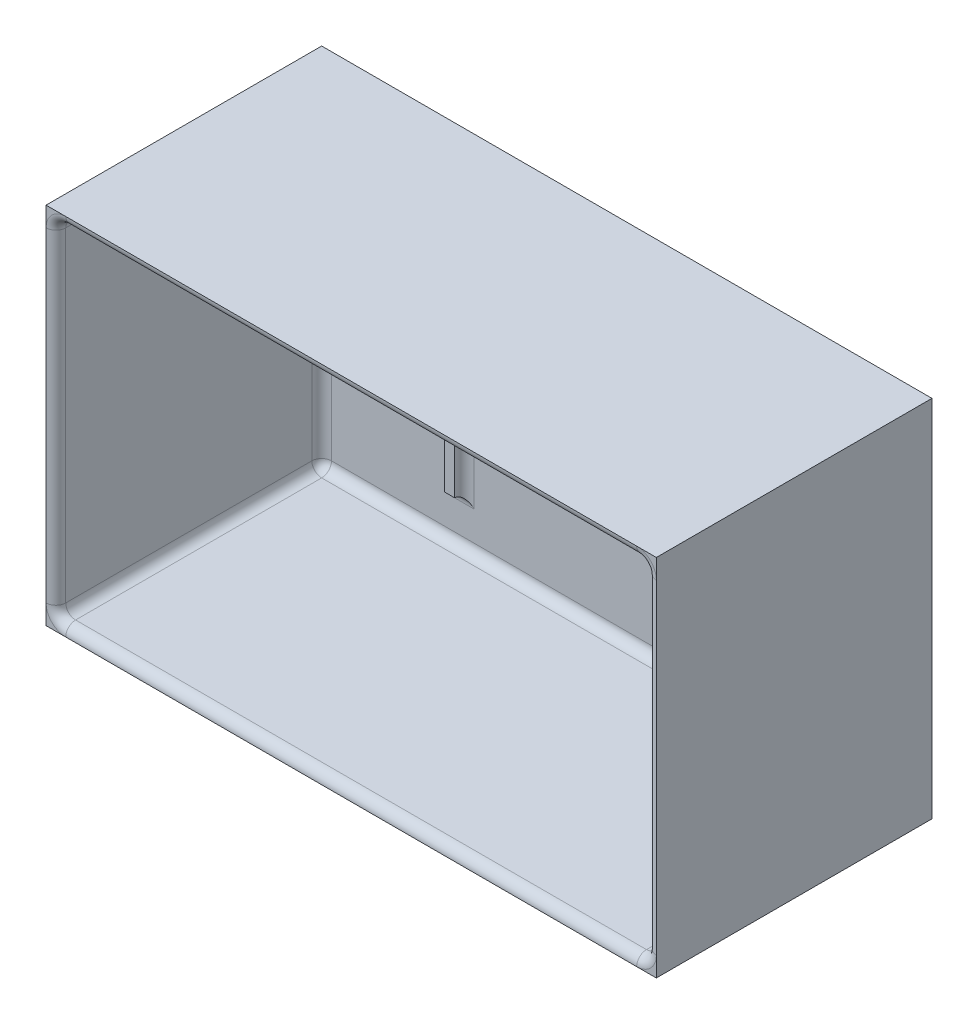
ISO-10303-21;
HEADER;
FILE_DESCRIPTION(('STEP AP214'),'2;1');
FILE_NAME('part.step','',(''),(''),'','','');
FILE_SCHEMA(('AUTOMOTIVE_DESIGN { 1 0 10303 214 1 1 1 1 }'));
ENDSEC;
DATA;
#1=APPLICATION_CONTEXT('core data for automotive mechanical design processes');
#2=APPLICATION_PROTOCOL_DEFINITION('international standard','automotive_design',2000,#1);
#3=PRODUCT_CONTEXT('',#1,'mechanical');
#4=PRODUCT('Part','Part','',(#3));
#5=PRODUCT_RELATED_PRODUCT_CATEGORY('part','',(#4));
#6=PRODUCT_DEFINITION_FORMATION('','',#4);
#7=PRODUCT_DEFINITION_CONTEXT('part definition',#1,'design');
#8=PRODUCT_DEFINITION('design','',#6,#7);
#9=PRODUCT_DEFINITION_SHAPE('','',#8);
#10=(LENGTH_UNIT() NAMED_UNIT(*) SI_UNIT(.MILLI.,.METRE.));
#11=(NAMED_UNIT(*) PLANE_ANGLE_UNIT() SI_UNIT($,.RADIAN.));
#12=(NAMED_UNIT(*) SI_UNIT($,.STERADIAN.) SOLID_ANGLE_UNIT());
#13=UNCERTAINTY_MEASURE_WITH_UNIT(LENGTH_MEASURE(1.E-05),#10,'distance_accuracy_value','');
#14=(GEOMETRIC_REPRESENTATION_CONTEXT(3) GLOBAL_UNCERTAINTY_ASSIGNED_CONTEXT((#13)) GLOBAL_UNIT_ASSIGNED_CONTEXT((#10,
#11,#12)) REPRESENTATION_CONTEXT('',''));
#15=CARTESIAN_POINT('',(0.,0.,0.));
#16=DIRECTION('',(0.,0.,1.));
#17=DIRECTION('',(1.,0.,0.));
#18=AXIS2_PLACEMENT_3D('',#15,#16,#17);
#19=CARTESIAN_POINT('',(0.,0.,1.));
#20=DIRECTION('',(0.,0.,-1.));
#21=DIRECTION('',(-1.,0.,0.));
#22=AXIS2_PLACEMENT_3D('',#19,#20,#21);
#23=PLANE('',#22);
#24=DIRECTION('',(-1.,0.,0.));
#25=VECTOR('',#24,1.);
#26=CARTESIAN_POINT('',(46.5,32.,1.));
#27=LINE('',#26,#25);
#28=CARTESIAN_POINT('',(44.5,32.,1.));
#29=VERTEX_POINT('',#28);
#30=CARTESIAN_POINT('',(47.5,32.,1.));
#31=VERTEX_POINT('',#30);
#32=EDGE_CURVE('E42',#29,#31,#27,.F.);
#33=ORIENTED_EDGE('',*,*,#32,.T.);
#34=DIRECTION('',(0.,1.,0.));
#35=VECTOR('',#34,1.);
#36=CARTESIAN_POINT('',(47.5,6.,1.));
#37=LINE('',#36,#35);
#38=CARTESIAN_POINT('',(47.5,5.,1.));
#39=VERTEX_POINT('',#38);
#40=EDGE_CURVE('E11',#31,#39,#37,.F.);
#41=ORIENTED_EDGE('',*,*,#40,.T.);
#42=DIRECTION('',(1.,0.,0.));
#43=VECTOR('',#42,1.);
#44=CARTESIAN_POINT('',(45.5,5.,1.));
#45=LINE('',#44,#43);
#46=CARTESIAN_POINT('',(44.5,5.,1.));
#47=VERTEX_POINT('',#46);
#48=EDGE_CURVE('E252',#39,#47,#45,.F.);
#49=ORIENTED_EDGE('',*,*,#48,.T.);
#50=DIRECTION('',(0.,-1.,0.));
#51=VECTOR('',#50,1.);
#52=CARTESIAN_POINT('',(44.5,31.,1.));
#53=LINE('',#52,#51);
#54=EDGE_CURVE('E229',#47,#29,#53,.F.);
#55=ORIENTED_EDGE('',*,*,#54,.T.);
#56=EDGE_LOOP('',(#33,#41,#49,#55));
#57=FACE_BOUND('',#56,.T.);
#58=DIRECTION('',(-1.,0.,0.));
#59=VECTOR('',#58,1.);
#60=CARTESIAN_POINT('',(15.5,32.,1.));
#61=LINE('',#60,#59);
#62=CARTESIAN_POINT('',(13.5,32.,1.));
#63=VERTEX_POINT('',#62);
#64=CARTESIAN_POINT('',(16.5,32.,1.));
#65=VERTEX_POINT('',#64);
#66=EDGE_CURVE('E257',#63,#65,#61,.F.);
#67=ORIENTED_EDGE('',*,*,#66,.T.);
#68=DIRECTION('',(0.,1.,0.));
#69=VECTOR('',#68,1.);
#70=CARTESIAN_POINT('',(16.5,6.,1.));
#71=LINE('',#70,#69);
#72=CARTESIAN_POINT('',(16.5,5.,1.));
#73=VERTEX_POINT('',#72);
#74=EDGE_CURVE('E255',#65,#73,#71,.F.);
#75=ORIENTED_EDGE('',*,*,#74,.T.);
#76=DIRECTION('',(1.,0.,0.));
#77=VECTOR('',#76,1.);
#78=CARTESIAN_POINT('',(14.5,5.,1.));
#79=LINE('',#78,#77);
#80=CARTESIAN_POINT('',(13.5,5.,1.));
#81=VERTEX_POINT('',#80);
#82=EDGE_CURVE('E260',#73,#81,#79,.F.);
#83=ORIENTED_EDGE('',*,*,#82,.T.);
#84=DIRECTION('',(0.,-1.,0.));
#85=VECTOR('',#84,1.);
#86=CARTESIAN_POINT('',(13.5,31.,1.));
#87=LINE('',#86,#85);
#88=EDGE_CURVE('E262',#81,#63,#87,.F.);
#89=ORIENTED_EDGE('',*,*,#88,.T.);
#90=EDGE_LOOP('',(#67,#75,#83,#89));
#91=FACE_BOUND('',#90,.T.);
#92=DIRECTION('',(0.,1.,0.));
#93=VECTOR('',#92,1.);
#94=CARTESIAN_POINT('',(60.,0.,1.));
#95=LINE('',#94,#93);
#96=CARTESIAN_POINT('',(60.,2.,1.));
#97=VERTEX_POINT('',#96);
#98=CARTESIAN_POINT('',(60.,35.,1.));
#99=VERTEX_POINT('',#98);
#100=EDGE_CURVE('E337',#97,#99,#95,.T.);
#101=ORIENTED_EDGE('',*,*,#100,.T.);
#102=DIRECTION('',(-1.,0.,0.));
#103=VECTOR('',#102,1.);
#104=CARTESIAN_POINT('',(0.,35.,1.));
#105=LINE('',#104,#103);
#106=CARTESIAN_POINT('',(2.,35.,1.));
#107=VERTEX_POINT('',#106);
#108=EDGE_CURVE('E264',#99,#107,#105,.T.);
#109=ORIENTED_EDGE('',*,*,#108,.T.);
#110=DIRECTION('',(0.,-1.,0.));
#111=VECTOR('',#110,1.);
#112=CARTESIAN_POINT('',(2.,0.,1.));
#113=LINE('',#112,#111);
#114=CARTESIAN_POINT('',(2.,2.,1.));
#115=VERTEX_POINT('',#114);
#116=EDGE_CURVE('E341',#107,#115,#113,.T.);
#117=ORIENTED_EDGE('',*,*,#116,.T.);
#118=DIRECTION('',(1.,0.,0.));
#119=VECTOR('',#118,1.);
#120=CARTESIAN_POINT('',(0.,2.,1.));
#121=LINE('',#120,#119);
#122=EDGE_CURVE('E339',#115,#97,#121,.T.);
#123=ORIENTED_EDGE('',*,*,#122,.T.);
#124=EDGE_LOOP('',(#101,#109,#117,#123));
#125=FACE_BOUND('',#124,.T.);
#126=ADVANCED_FACE('F33',(#57,#91,#125),#23,.F.);
#127=CARTESIAN_POINT('',(0.,0.,28.));
#128=DIRECTION('',(0.,0.,-1.));
#129=DIRECTION('',(-1.,0.,0.));
#130=AXIS2_PLACEMENT_3D('',#127,#128,#129);
#131=PLANE('',#130);
#132=CARTESIAN_POINT('',(2.,2.,28.));
#133=DIRECTION('',(0.,0.,-1.));
#134=DIRECTION('',(-1.,0.,0.));
#135=AXIS2_PLACEMENT_3D('',#132,#133,#134);
#136=CIRCLE('',#135,2.);
#137=CARTESIAN_POINT('',(0.,2.,28.));
#138=VERTEX_POINT('',#137);
#139=CARTESIAN_POINT('',(2.,0.,28.));
#140=VERTEX_POINT('',#139);
#141=EDGE_CURVE('E370',#138,#140,#136,.F.);
#142=ORIENTED_EDGE('',*,*,#141,.F.);
#143=DIRECTION('',(0.,-1.,0.));
#144=VECTOR('',#143,1.);
#145=CARTESIAN_POINT('',(0.,0.,28.));
#146=LINE('',#145,#144);
#147=CARTESIAN_POINT('',(0.,0.,28.));
#148=VERTEX_POINT('',#147);
#149=EDGE_CURVE('E406',#138,#148,#146,.T.);
#150=ORIENTED_EDGE('',*,*,#149,.T.);
#151=DIRECTION('',(1.,0.,0.));
#152=VECTOR('',#151,1.);
#153=CARTESIAN_POINT('',(0.,0.,28.));
#154=LINE('',#153,#152);
#155=EDGE_CURVE('E422',#148,#140,#154,.T.);
#156=ORIENTED_EDGE('',*,*,#155,.T.);
#157=EDGE_LOOP('',(#142,#150,#156));
#158=FACE_BOUND('',#157,.T.);
#159=ADVANCED_FACE('F454',(#158),#131,.F.);
#160=CARTESIAN_POINT('',(60.,35.,28.));
#161=DIRECTION('',(0.,0.,-1.));
#162=DIRECTION('',(-1.,0.,0.));
#163=AXIS2_PLACEMENT_3D('',#160,#161,#162);
#164=CIRCLE('',#163,2.);
#165=CARTESIAN_POINT('',(62.,35.,28.));
#166=VERTEX_POINT('',#165);
#167=CARTESIAN_POINT('',(60.,37.,28.));
#168=VERTEX_POINT('',#167);
#169=EDGE_CURVE('E373',#166,#168,#164,.F.);
#170=ORIENTED_EDGE('',*,*,#169,.F.);
#171=DIRECTION('',(0.,1.,0.));
#172=VECTOR('',#171,1.);
#173=CARTESIAN_POINT('',(62.,0.,28.));
#174=LINE('',#173,#172);
#175=CARTESIAN_POINT('',(62.,37.,28.));
#176=VERTEX_POINT('',#175);
#177=EDGE_CURVE('E421',#166,#176,#174,.T.);
#178=ORIENTED_EDGE('',*,*,#177,.T.);
#179=DIRECTION('',(-1.,0.,0.));
#180=VECTOR('',#179,1.);
#181=CARTESIAN_POINT('',(0.,37.,28.));
#182=LINE('',#181,#180);
#183=EDGE_CURVE('E403',#176,#168,#182,.T.);
#184=ORIENTED_EDGE('',*,*,#183,.T.);
#185=EDGE_LOOP('',(#170,#178,#184));
#186=FACE_BOUND('',#185,.T.);
#187=ADVANCED_FACE('F459',(#186),#131,.F.);
#188=CARTESIAN_POINT('',(60.,2.,28.));
#189=DIRECTION('',(0.,0.,-1.));
#190=DIRECTION('',(-1.,0.,0.));
#191=AXIS2_PLACEMENT_3D('',#188,#189,#190);
#192=CIRCLE('',#191,2.);
#193=CARTESIAN_POINT('',(60.,0.,28.));
#194=VERTEX_POINT('',#193);
#195=CARTESIAN_POINT('',(62.,2.,28.));
#196=VERTEX_POINT('',#195);
#197=EDGE_CURVE('E376',#194,#196,#192,.F.);
#198=ORIENTED_EDGE('',*,*,#197,.F.);
#199=CARTESIAN_POINT('',(62.,0.,28.));
#200=VERTEX_POINT('',#199);
#201=EDGE_CURVE('E426',#194,#200,#154,.T.);
#202=ORIENTED_EDGE('',*,*,#201,.T.);
#203=EDGE_CURVE('E417',#200,#196,#174,.T.);
#204=ORIENTED_EDGE('',*,*,#203,.T.);
#205=EDGE_LOOP('',(#198,#202,#204));
#206=FACE_BOUND('',#205,.T.);
#207=ADVANCED_FACE('F623',(#206),#131,.F.);
#208=CARTESIAN_POINT('',(2.,35.,28.));
#209=DIRECTION('',(0.,0.,-1.));
#210=DIRECTION('',(-1.,0.,0.));
#211=AXIS2_PLACEMENT_3D('',#208,#209,#210);
#212=CIRCLE('',#211,2.);
#213=CARTESIAN_POINT('',(2.,37.,28.));
#214=VERTEX_POINT('',#213);
#215=CARTESIAN_POINT('',(0.,35.,28.));
#216=VERTEX_POINT('',#215);
#217=EDGE_CURVE('E379',#214,#216,#212,.F.);
#218=ORIENTED_EDGE('',*,*,#217,.F.);
#219=CARTESIAN_POINT('',(0.,37.,28.));
#220=VERTEX_POINT('',#219);
#221=EDGE_CURVE('E416',#214,#220,#182,.T.);
#222=ORIENTED_EDGE('',*,*,#221,.T.);
#223=EDGE_CURVE('E427',#220,#216,#146,.T.);
#224=ORIENTED_EDGE('',*,*,#223,.T.);
#225=EDGE_LOOP('',(#218,#222,#224));
#226=FACE_BOUND('',#225,.T.);
#227=ADVANCED_FACE('F462',(#226),#131,.F.);
#228=CARTESIAN_POINT('',(0.,0.,28.));
#229=DIRECTION('',(1.,0.,0.));
#230=DIRECTION('',(0.,0.,-1.));
#231=AXIS2_PLACEMENT_3D('',#228,#229,#230);
#232=PLANE('',#231);
#233=DIRECTION('',(0.,-1.,0.));
#234=VECTOR('',#233,1.);
#235=CARTESIAN_POINT('',(0.,0.,0.));
#236=LINE('',#235,#234);
#237=CARTESIAN_POINT('',(0.,37.,0.));
#238=VERTEX_POINT('',#237);
#239=CARTESIAN_POINT('',(0.,0.,0.));
#240=VERTEX_POINT('',#239);
#241=EDGE_CURVE('E268',#238,#240,#236,.T.);
#242=ORIENTED_EDGE('',*,*,#241,.T.);
#243=DIRECTION('',(0.,0.,-1.));
#244=VECTOR('',#243,1.);
#245=CARTESIAN_POINT('',(0.,0.,28.));
#246=LINE('',#245,#244);
#247=EDGE_CURVE('E391',#148,#240,#246,.T.);
#248=ORIENTED_EDGE('',*,*,#247,.F.);
#249=ORIENTED_EDGE('',*,*,#149,.F.);
#250=EDGE_CURVE('E430',#216,#138,#146,.T.);
#251=ORIENTED_EDGE('',*,*,#250,.F.);
#252=ORIENTED_EDGE('',*,*,#223,.F.);
#253=DIRECTION('',(0.,0.,-1.));
#254=VECTOR('',#253,1.);
#255=CARTESIAN_POINT('',(0.,37.,28.));
#256=LINE('',#255,#254);
#257=EDGE_CURVE('E400',#220,#238,#256,.T.);
#258=ORIENTED_EDGE('',*,*,#257,.T.);
#259=EDGE_LOOP('',(#242,#248,#249,#251,#252,#258));
#260=FACE_BOUND('',#259,.T.);
#261=ADVANCED_FACE('F484',(#260),#232,.F.);
#262=CARTESIAN_POINT('',(0.,0.,28.));
#263=DIRECTION('',(0.,1.,0.));
#264=DIRECTION('',(0.,0.,1.));
#265=AXIS2_PLACEMENT_3D('',#262,#263,#264);
#266=PLANE('',#265);
#267=DIRECTION('',(1.,0.,0.));
#268=VECTOR('',#267,1.);
#269=CARTESIAN_POINT('',(0.,0.,0.));
#270=LINE('',#269,#268);
#271=CARTESIAN_POINT('',(62.,0.,0.));
#272=VERTEX_POINT('',#271);
#273=EDGE_CURVE('E409',#240,#272,#270,.T.);
#274=ORIENTED_EDGE('',*,*,#273,.T.);
#275=DIRECTION('',(0.,0.,-1.));
#276=VECTOR('',#275,1.);
#277=CARTESIAN_POINT('',(62.,0.,28.));
#278=LINE('',#277,#276);
#279=EDGE_CURVE('E394',#200,#272,#278,.T.);
#280=ORIENTED_EDGE('',*,*,#279,.F.);
#281=ORIENTED_EDGE('',*,*,#201,.F.);
#282=EDGE_CURVE('E425',#140,#194,#154,.T.);
#283=ORIENTED_EDGE('',*,*,#282,.F.);
#284=ORIENTED_EDGE('',*,*,#155,.F.);
#285=ORIENTED_EDGE('',*,*,#247,.T.);
#286=EDGE_LOOP('',(#274,#280,#281,#283,#284,#285));
#287=FACE_BOUND('',#286,.T.);
#288=ADVANCED_FACE('F480',(#287),#266,.F.);
#289=CARTESIAN_POINT('',(62.,0.,28.));
#290=DIRECTION('',(-1.,0.,0.));
#291=DIRECTION('',(0.,0.,1.));
#292=AXIS2_PLACEMENT_3D('',#289,#290,#291);
#293=PLANE('',#292);
#294=DIRECTION('',(0.,1.,0.));
#295=VECTOR('',#294,1.);
#296=CARTESIAN_POINT('',(62.,0.,0.));
#297=LINE('',#296,#295);
#298=CARTESIAN_POINT('',(62.,37.,0.));
#299=VERTEX_POINT('',#298);
#300=EDGE_CURVE('E407',#272,#299,#297,.T.);
#301=ORIENTED_EDGE('',*,*,#300,.T.);
#302=DIRECTION('',(0.,0.,-1.));
#303=VECTOR('',#302,1.);
#304=CARTESIAN_POINT('',(62.,37.,28.));
#305=LINE('',#304,#303);
#306=EDGE_CURVE('E397',#176,#299,#305,.T.);
#307=ORIENTED_EDGE('',*,*,#306,.F.);
#308=ORIENTED_EDGE('',*,*,#177,.F.);
#309=EDGE_CURVE('E420',#196,#166,#174,.T.);
#310=ORIENTED_EDGE('',*,*,#309,.F.);
#311=ORIENTED_EDGE('',*,*,#203,.F.);
#312=ORIENTED_EDGE('',*,*,#279,.T.);
#313=EDGE_LOOP('',(#301,#307,#308,#310,#311,#312));
#314=FACE_BOUND('',#313,.T.);
#315=ADVANCED_FACE('F476',(#314),#293,.F.);
#316=CARTESIAN_POINT('',(0.,37.,28.));
#317=DIRECTION('',(0.,-1.,0.));
#318=DIRECTION('',(0.,0.,-1.));
#319=AXIS2_PLACEMENT_3D('',#316,#317,#318);
#320=PLANE('',#319);
#321=DIRECTION('',(-1.,0.,0.));
#322=VECTOR('',#321,1.);
#323=CARTESIAN_POINT('',(0.,37.,0.));
#324=LINE('',#323,#322);
#325=EDGE_CURVE('E404',#299,#238,#324,.T.);
#326=ORIENTED_EDGE('',*,*,#325,.T.);
#327=ORIENTED_EDGE('',*,*,#257,.F.);
#328=ORIENTED_EDGE('',*,*,#221,.F.);
#329=EDGE_CURVE('E415',#168,#214,#182,.T.);
#330=ORIENTED_EDGE('',*,*,#329,.F.);
#331=ORIENTED_EDGE('',*,*,#183,.F.);
#332=ORIENTED_EDGE('',*,*,#306,.T.);
#333=EDGE_LOOP('',(#326,#327,#328,#330,#331,#332));
#334=FACE_BOUND('',#333,.T.);
#335=ADVANCED_FACE('F472',(#334),#320,.F.);
#336=CARTESIAN_POINT('',(0.,0.,0.));
#337=DIRECTION('',(0.,0.,-1.));
#338=DIRECTION('',(-1.,0.,0.));
#339=AXIS2_PLACEMENT_3D('',#336,#337,#338);
#340=PLANE('',#339);
#341=ORIENTED_EDGE('',*,*,#241,.F.);
#342=ORIENTED_EDGE('',*,*,#325,.F.);
#343=ORIENTED_EDGE('',*,*,#300,.F.);
#344=ORIENTED_EDGE('',*,*,#273,.F.);
#345=EDGE_LOOP('',(#341,#342,#343,#344));
#346=FACE_BOUND('',#345,.T.);
#347=ADVANCED_FACE('F468',(#346),#340,.T.);
#348=CARTESIAN_POINT('',(1.,0.,28.));
#349=DIRECTION('',(1.,0.,0.));
#350=DIRECTION('',(0.,0.,-1.));
#351=AXIS2_PLACEMENT_3D('',#348,#349,#350);
#352=PLANE('',#351);
#353=DIRECTION('',(0.,-1.,0.));
#354=VECTOR('',#353,1.);
#355=CARTESIAN_POINT('',(1.,1.,27.));
#356=LINE('',#355,#354);
#357=CARTESIAN_POINT('',(1.,35.,27.));
#358=VERTEX_POINT('',#357);
#359=CARTESIAN_POINT('',(1.,2.,27.));
#360=VERTEX_POINT('',#359);
#361=EDGE_CURVE('E346',#358,#360,#356,.T.);
#362=ORIENTED_EDGE('',*,*,#361,.T.);
#363=DIRECTION('',(0.,0.,-1.));
#364=VECTOR('',#363,1.);
#365=CARTESIAN_POINT('',(1.,2.,1.));
#366=LINE('',#365,#364);
#367=CARTESIAN_POINT('',(1.,2.,2.));
#368=VERTEX_POINT('',#367);
#369=EDGE_CURVE('E343',#360,#368,#366,.T.);
#370=ORIENTED_EDGE('',*,*,#369,.T.);
#371=DIRECTION('',(0.,-1.,0.));
#372=VECTOR('',#371,1.);
#373=CARTESIAN_POINT('',(1.,0.,2.));
#374=LINE('',#373,#372);
#375=CARTESIAN_POINT('',(1.,35.,2.));
#376=VERTEX_POINT('',#375);
#377=EDGE_CURVE('E350',#368,#376,#374,.F.);
#378=ORIENTED_EDGE('',*,*,#377,.T.);
#379=DIRECTION('',(0.,0.,-1.));
#380=VECTOR('',#379,1.);
#381=CARTESIAN_POINT('',(1.,35.,28.));
#382=LINE('',#381,#380);
#383=EDGE_CURVE('E348',#376,#358,#382,.F.);
#384=ORIENTED_EDGE('',*,*,#383,.T.);
#385=EDGE_LOOP('',(#362,#370,#378,#384));
#386=FACE_BOUND('',#385,.T.);
#387=ADVANCED_FACE('F471',(#386),#352,.T.);
#388=CARTESIAN_POINT('',(0.,1.,28.));
#389=DIRECTION('',(0.,1.,0.));
#390=DIRECTION('',(0.,0.,1.));
#391=AXIS2_PLACEMENT_3D('',#388,#389,#390);
#392=PLANE('',#391);
#393=DIRECTION('',(0.,0.,-1.));
#394=VECTOR('',#393,1.);
#395=CARTESIAN_POINT('',(2.,1.,28.));
#396=LINE('',#395,#394);
#397=CARTESIAN_POINT('',(2.,1.,2.));
#398=VERTEX_POINT('',#397);
#399=CARTESIAN_POINT('',(2.,1.,27.));
#400=VERTEX_POINT('',#399);
#401=EDGE_CURVE('E387',#398,#400,#396,.F.);
#402=ORIENTED_EDGE('',*,*,#401,.T.);
#403=DIRECTION('',(1.,0.,0.));
#404=VECTOR('',#403,1.);
#405=CARTESIAN_POINT('',(61.,1.,27.));
#406=LINE('',#405,#404);
#407=CARTESIAN_POINT('',(60.,1.,27.));
#408=VERTEX_POINT('',#407);
#409=EDGE_CURVE('E382',#400,#408,#406,.T.);
#410=ORIENTED_EDGE('',*,*,#409,.T.);
#411=DIRECTION('',(0.,0.,-1.));
#412=VECTOR('',#411,1.);
#413=CARTESIAN_POINT('',(60.,1.,1.));
#414=LINE('',#413,#412);
#415=CARTESIAN_POINT('',(60.,1.,2.));
#416=VERTEX_POINT('',#415);
#417=EDGE_CURVE('E385',#408,#416,#414,.T.);
#418=ORIENTED_EDGE('',*,*,#417,.T.);
#419=DIRECTION('',(1.,0.,0.));
#420=VECTOR('',#419,1.);
#421=CARTESIAN_POINT('',(0.,1.,2.));
#422=LINE('',#421,#420);
#423=EDGE_CURVE('E389',#416,#398,#422,.F.);
#424=ORIENTED_EDGE('',*,*,#423,.T.);
#425=EDGE_LOOP('',(#402,#410,#418,#424));
#426=FACE_BOUND('',#425,.T.);
#427=ADVANCED_FACE('F616',(#426),#392,.T.);
#428=CARTESIAN_POINT('',(61.,0.,28.));
#429=DIRECTION('',(-1.,0.,0.));
#430=DIRECTION('',(0.,0.,1.));
#431=AXIS2_PLACEMENT_3D('',#428,#429,#430);
#432=PLANE('',#431);
#433=DIRECTION('',(0.,1.,0.));
#434=VECTOR('',#433,1.);
#435=CARTESIAN_POINT('',(61.,36.,27.));
#436=LINE('',#435,#434);
#437=CARTESIAN_POINT('',(61.,2.,27.));
#438=VERTEX_POINT('',#437);
#439=CARTESIAN_POINT('',(61.,35.,27.));
#440=VERTEX_POINT('',#439);
#441=EDGE_CURVE('E355',#438,#440,#436,.T.);
#442=ORIENTED_EDGE('',*,*,#441,.T.);
#443=DIRECTION('',(0.,0.,-1.));
#444=VECTOR('',#443,1.);
#445=CARTESIAN_POINT('',(61.,35.,1.));
#446=LINE('',#445,#444);
#447=CARTESIAN_POINT('',(61.,35.,2.));
#448=VERTEX_POINT('',#447);
#449=EDGE_CURVE('E352',#440,#448,#446,.T.);
#450=ORIENTED_EDGE('',*,*,#449,.T.);
#451=DIRECTION('',(0.,1.,0.));
#452=VECTOR('',#451,1.);
#453=CARTESIAN_POINT('',(61.,0.,2.));
#454=LINE('',#453,#452);
#455=CARTESIAN_POINT('',(61.,2.,2.));
#456=VERTEX_POINT('',#455);
#457=EDGE_CURVE('E359',#448,#456,#454,.F.);
#458=ORIENTED_EDGE('',*,*,#457,.T.);
#459=DIRECTION('',(0.,0.,-1.));
#460=VECTOR('',#459,1.);
#461=CARTESIAN_POINT('',(61.,2.,28.));
#462=LINE('',#461,#460);
#463=EDGE_CURVE('E357',#456,#438,#462,.F.);
#464=ORIENTED_EDGE('',*,*,#463,.T.);
#465=EDGE_LOOP('',(#442,#450,#458,#464));
#466=FACE_BOUND('',#465,.T.);
#467=ADVANCED_FACE('F571',(#466),#432,.T.);
#468=CARTESIAN_POINT('',(0.,36.,28.));
#469=DIRECTION('',(0.,-1.,0.));
#470=DIRECTION('',(0.,0.,-1.));
#471=AXIS2_PLACEMENT_3D('',#468,#469,#470);
#472=PLANE('',#471);
#473=DIRECTION('',(0.,0.,-1.));
#474=VECTOR('',#473,1.);
#475=CARTESIAN_POINT('',(60.,36.,28.));
#476=LINE('',#475,#474);
#477=CARTESIAN_POINT('',(60.,36.,2.));
#478=VERTEX_POINT('',#477);
#479=CARTESIAN_POINT('',(60.,36.,27.));
#480=VERTEX_POINT('',#479);
#481=EDGE_CURVE('E364',#478,#480,#476,.F.);
#482=ORIENTED_EDGE('',*,*,#481,.T.);
#483=DIRECTION('',(-1.,0.,0.));
#484=VECTOR('',#483,1.);
#485=CARTESIAN_POINT('',(1.,36.,27.));
#486=LINE('',#485,#484);
#487=CARTESIAN_POINT('',(2.,36.,27.));
#488=VERTEX_POINT('',#487);
#489=EDGE_CURVE('E361',#480,#488,#486,.T.);
#490=ORIENTED_EDGE('',*,*,#489,.T.);
#491=DIRECTION('',(0.,0.,-1.));
#492=VECTOR('',#491,1.);
#493=CARTESIAN_POINT('',(2.,36.,1.));
#494=LINE('',#493,#492);
#495=CARTESIAN_POINT('',(2.,36.,2.));
#496=VERTEX_POINT('',#495);
#497=EDGE_CURVE('E366',#488,#496,#494,.T.);
#498=ORIENTED_EDGE('',*,*,#497,.T.);
#499=DIRECTION('',(-1.,0.,0.));
#500=VECTOR('',#499,1.);
#501=CARTESIAN_POINT('',(0.,36.,2.));
#502=LINE('',#501,#500);
#503=EDGE_CURVE('E368',#496,#478,#502,.F.);
#504=ORIENTED_EDGE('',*,*,#503,.T.);
#505=EDGE_LOOP('',(#482,#490,#498,#504));
#506=FACE_BOUND('',#505,.T.);
#507=ADVANCED_FACE('F465',(#506),#472,.T.);
#508=CARTESIAN_POINT('',(0.,35.,2.));
#509=DIRECTION('',(-1.,0.,0.));
#510=DIRECTION('',(0.,0.,1.));
#511=AXIS2_PLACEMENT_3D('',#508,#509,#510);
#512=CYLINDRICAL_SURFACE('',#511,1.);
#513=CARTESIAN_POINT('',(2.,35.,2.));
#514=DIRECTION('',(1.,0.,0.));
#515=DIRECTION('',(0.,0.,-1.));
#516=AXIS2_PLACEMENT_3D('',#513,#514,#515);
#517=CIRCLE('',#516,1.);
#518=EDGE_CURVE('E265',#107,#496,#517,.T.);
#519=ORIENTED_EDGE('',*,*,#518,.F.);
#520=ORIENTED_EDGE('',*,*,#108,.F.);
#521=CARTESIAN_POINT('',(60.,35.,2.));
#522=DIRECTION('',(-1.,0.,0.));
#523=DIRECTION('',(0.,0.,1.));
#524=AXIS2_PLACEMENT_3D('',#521,#522,#523);
#525=CIRCLE('',#524,1.);
#526=EDGE_CURVE('E269',#478,#99,#525,.T.);
#527=ORIENTED_EDGE('',*,*,#526,.F.);
#528=ORIENTED_EDGE('',*,*,#503,.F.);
#529=EDGE_LOOP('',(#519,#520,#527,#528));
#530=FACE_BOUND('',#529,.T.);
#531=ADVANCED_FACE('F564',(#530),#512,.F.);
#532=CARTESIAN_POINT('',(2.,35.,2.));
#533=DIRECTION('',(0.,0.,1.));
#534=DIRECTION('',(1.,0.,0.));
#535=AXIS2_PLACEMENT_3D('',#532,#533,#534);
#536=SPHERICAL_SURFACE('',#535,1.);
#537=CARTESIAN_POINT('',(2.,35.,2.));
#538=DIRECTION('',(0.,-1.,0.));
#539=DIRECTION('',(0.,0.,-1.));
#540=AXIS2_PLACEMENT_3D('',#537,#538,#539);
#541=CIRCLE('',#540,1.);
#542=EDGE_CURVE('E275',#107,#376,#541,.F.);
#543=ORIENTED_EDGE('',*,*,#542,.F.);
#544=ORIENTED_EDGE('',*,*,#518,.T.);
#545=CARTESIAN_POINT('',(2.,35.,2.));
#546=DIRECTION('',(0.,0.,1.));
#547=DIRECTION('',(1.,0.,0.));
#548=AXIS2_PLACEMENT_3D('',#545,#546,#547);
#549=CIRCLE('',#548,1.);
#550=EDGE_CURVE('E272',#376,#496,#549,.F.);
#551=ORIENTED_EDGE('',*,*,#550,.F.);
#552=EDGE_LOOP('',(#543,#544,#551));
#553=FACE_BOUND('',#552,.T.);
#554=ADVANCED_FACE('F561',(#553),#536,.F.);
#555=CARTESIAN_POINT('',(60.,35.,2.));
#556=DIRECTION('',(0.,0.,1.));
#557=DIRECTION('',(1.,0.,0.));
#558=AXIS2_PLACEMENT_3D('',#555,#556,#557);
#559=SPHERICAL_SURFACE('',#558,1.);
#560=CARTESIAN_POINT('',(60.,35.,2.));
#561=DIRECTION('',(0.,0.,1.));
#562=DIRECTION('',(1.,0.,0.));
#563=AXIS2_PLACEMENT_3D('',#560,#561,#562);
#564=CIRCLE('',#563,1.);
#565=EDGE_CURVE('E281',#478,#448,#564,.F.);
#566=ORIENTED_EDGE('',*,*,#565,.F.);
#567=ORIENTED_EDGE('',*,*,#526,.T.);
#568=CARTESIAN_POINT('',(60.,35.,2.));
#569=DIRECTION('',(0.,-1.,0.));
#570=DIRECTION('',(0.,0.,-1.));
#571=AXIS2_PLACEMENT_3D('',#568,#569,#570);
#572=CIRCLE('',#571,1.);
#573=EDGE_CURVE('E278',#448,#99,#572,.F.);
#574=ORIENTED_EDGE('',*,*,#573,.F.);
#575=EDGE_LOOP('',(#566,#567,#574));
#576=FACE_BOUND('',#575,.T.);
#577=ADVANCED_FACE('F557',(#576),#559,.F.);
#578=CARTESIAN_POINT('',(2.,35.,28.));
#579=DIRECTION('',(0.,0.,1.));
#580=DIRECTION('',(1.,0.,0.));
#581=AXIS2_PLACEMENT_3D('',#578,#579,#580);
#582=CYLINDRICAL_SURFACE('',#581,1.);
#583=ORIENTED_EDGE('',*,*,#550,.T.);
#584=ORIENTED_EDGE('',*,*,#497,.F.);
#585=CARTESIAN_POINT('',(2.,35.,27.));
#586=DIRECTION('',(0.,0.,-1.));
#587=DIRECTION('',(-1.,0.,0.));
#588=AXIS2_PLACEMENT_3D('',#585,#586,#587);
#589=CIRCLE('',#588,1.);
#590=EDGE_CURVE('E287',#358,#488,#589,.T.);
#591=ORIENTED_EDGE('',*,*,#590,.F.);
#592=ORIENTED_EDGE('',*,*,#383,.F.);
#593=EDGE_LOOP('',(#583,#584,#591,#592));
#594=FACE_BOUND('',#593,.T.);
#595=ADVANCED_FACE('F553',(#594),#582,.F.);
#596=CARTESIAN_POINT('',(2.,0.,2.));
#597=DIRECTION('',(0.,-1.,0.));
#598=DIRECTION('',(0.,0.,-1.));
#599=AXIS2_PLACEMENT_3D('',#596,#597,#598);
#600=CYLINDRICAL_SURFACE('',#599,1.);
#601=ORIENTED_EDGE('',*,*,#542,.T.);
#602=ORIENTED_EDGE('',*,*,#377,.F.);
#603=CARTESIAN_POINT('',(2.,2.,2.));
#604=DIRECTION('',(0.,1.,0.));
#605=DIRECTION('',(0.,0.,1.));
#606=AXIS2_PLACEMENT_3D('',#603,#604,#605);
#607=CIRCLE('',#606,1.);
#608=EDGE_CURVE('E289',#115,#368,#607,.T.);
#609=ORIENTED_EDGE('',*,*,#608,.F.);
#610=ORIENTED_EDGE('',*,*,#116,.F.);
#611=EDGE_LOOP('',(#601,#602,#609,#610));
#612=FACE_BOUND('',#611,.T.);
#613=ADVANCED_FACE('F549',(#612),#600,.F.);
#614=CARTESIAN_POINT('',(0.,2.,2.));
#615=DIRECTION('',(1.,0.,0.));
#616=DIRECTION('',(0.,0.,-1.));
#617=AXIS2_PLACEMENT_3D('',#614,#615,#616);
#618=CYLINDRICAL_SURFACE('',#617,1.);
#619=CARTESIAN_POINT('',(60.,2.,2.));
#620=DIRECTION('',(-1.,0.,0.));
#621=DIRECTION('',(0.,0.,1.));
#622=AXIS2_PLACEMENT_3D('',#619,#620,#621);
#623=CIRCLE('',#622,1.);
#624=EDGE_CURVE('E295',#97,#416,#623,.T.);
#625=ORIENTED_EDGE('',*,*,#624,.F.);
#626=ORIENTED_EDGE('',*,*,#122,.F.);
#627=CARTESIAN_POINT('',(2.,2.,2.));
#628=DIRECTION('',(1.,0.,0.));
#629=DIRECTION('',(0.,0.,-1.));
#630=AXIS2_PLACEMENT_3D('',#627,#628,#629);
#631=CIRCLE('',#630,1.);
#632=EDGE_CURVE('E292',#398,#115,#631,.T.);
#633=ORIENTED_EDGE('',*,*,#632,.F.);
#634=ORIENTED_EDGE('',*,*,#423,.F.);
#635=EDGE_LOOP('',(#625,#626,#633,#634));
#636=FACE_BOUND('',#635,.T.);
#637=ADVANCED_FACE('F545',(#636),#618,.F.);
#638=CARTESIAN_POINT('',(60.,0.,2.));
#639=DIRECTION('',(0.,1.,0.));
#640=DIRECTION('',(0.,0.,1.));
#641=AXIS2_PLACEMENT_3D('',#638,#639,#640);
#642=CYLINDRICAL_SURFACE('',#641,1.);
#643=ORIENTED_EDGE('',*,*,#573,.T.);
#644=ORIENTED_EDGE('',*,*,#100,.F.);
#645=CARTESIAN_POINT('',(60.,2.,2.));
#646=DIRECTION('',(0.,1.,0.));
#647=DIRECTION('',(0.,0.,1.));
#648=AXIS2_PLACEMENT_3D('',#645,#646,#647);
#649=CIRCLE('',#648,1.);
#650=EDGE_CURVE('E298',#456,#97,#649,.T.);
#651=ORIENTED_EDGE('',*,*,#650,.F.);
#652=ORIENTED_EDGE('',*,*,#457,.F.);
#653=EDGE_LOOP('',(#643,#644,#651,#652));
#654=FACE_BOUND('',#653,.T.);
#655=ADVANCED_FACE('F541',(#654),#642,.F.);
#656=CARTESIAN_POINT('',(60.,35.,28.));
#657=DIRECTION('',(0.,0.,1.));
#658=DIRECTION('',(1.,0.,0.));
#659=AXIS2_PLACEMENT_3D('',#656,#657,#658);
#660=CYLINDRICAL_SURFACE('',#659,1.);
#661=ORIENTED_EDGE('',*,*,#565,.T.);
#662=ORIENTED_EDGE('',*,*,#449,.F.);
#663=CARTESIAN_POINT('',(60.,35.,27.));
#664=DIRECTION('',(0.,0.,-1.));
#665=DIRECTION('',(-1.,0.,0.));
#666=AXIS2_PLACEMENT_3D('',#663,#664,#665);
#667=CIRCLE('',#666,1.);
#668=EDGE_CURVE('E301',#480,#440,#667,.T.);
#669=ORIENTED_EDGE('',*,*,#668,.F.);
#670=ORIENTED_EDGE('',*,*,#481,.F.);
#671=EDGE_LOOP('',(#661,#662,#669,#670));
#672=FACE_BOUND('',#671,.T.);
#673=ADVANCED_FACE('F537',(#672),#660,.F.);
#674=CARTESIAN_POINT('',(0.,37.,27.));
#675=DIRECTION('',(1.,0.,0.));
#676=DIRECTION('',(0.,0.,-1.));
#677=AXIS2_PLACEMENT_3D('',#674,#675,#676);
#678=CYLINDRICAL_SURFACE('',#677,1.);
#679=CARTESIAN_POINT('',(60.,37.,27.));
#680=DIRECTION('',(1.,0.,0.));
#681=DIRECTION('',(0.,0.,-1.));
#682=AXIS2_PLACEMENT_3D('',#679,#680,#681);
#683=CIRCLE('',#682,1.);
#684=EDGE_CURVE('E304',#168,#480,#683,.T.);
#685=ORIENTED_EDGE('',*,*,#684,.F.);
#686=ORIENTED_EDGE('',*,*,#329,.T.);
#687=CARTESIAN_POINT('',(2.,37.,27.));
#688=DIRECTION('',(-1.,0.,0.));
#689=DIRECTION('',(0.,0.,1.));
#690=AXIS2_PLACEMENT_3D('',#687,#688,#689);
#691=CIRCLE('',#690,1.);
#692=EDGE_CURVE('E284',#488,#214,#691,.T.);
#693=ORIENTED_EDGE('',*,*,#692,.F.);
#694=ORIENTED_EDGE('',*,*,#489,.F.);
#695=EDGE_LOOP('',(#685,#686,#693,#694));
#696=FACE_BOUND('',#695,.T.);
#697=ADVANCED_FACE('F533',(#696),#678,.T.);
#698=CARTESIAN_POINT('',(2.,35.,27.));
#699=DIRECTION('',(0.,0.,-1.));
#700=DIRECTION('',(-1.,0.,0.));
#701=AXIS2_PLACEMENT_3D('',#698,#699,#700);
#702=TOROIDAL_SURFACE('',#701,2.,1.);
#703=ORIENTED_EDGE('',*,*,#692,.T.);
#704=ORIENTED_EDGE('',*,*,#217,.T.);
#705=CARTESIAN_POINT('',(0.,35.,27.));
#706=DIRECTION('',(0.,1.,0.));
#707=DIRECTION('',(0.,0.,1.));
#708=AXIS2_PLACEMENT_3D('',#705,#706,#707);
#709=CIRCLE('',#708,1.);
#710=EDGE_CURVE('E307',#358,#216,#709,.F.);
#711=ORIENTED_EDGE('',*,*,#710,.F.);
#712=ORIENTED_EDGE('',*,*,#590,.T.);
#713=EDGE_LOOP('',(#703,#704,#711,#712));
#714=FACE_BOUND('',#713,.T.);
#715=ADVANCED_FACE('F529',(#714),#702,.T.);
#716=CARTESIAN_POINT('',(2.,2.,2.));
#717=DIRECTION('',(0.,0.,1.));
#718=DIRECTION('',(1.,0.,0.));
#719=AXIS2_PLACEMENT_3D('',#716,#717,#718);
#720=SPHERICAL_SURFACE('',#719,1.);
#721=ORIENTED_EDGE('',*,*,#632,.T.);
#722=ORIENTED_EDGE('',*,*,#608,.T.);
#723=CARTESIAN_POINT('',(2.,2.,2.));
#724=DIRECTION('',(0.,0.,1.));
#725=DIRECTION('',(1.,0.,0.));
#726=AXIS2_PLACEMENT_3D('',#723,#724,#725);
#727=CIRCLE('',#726,1.);
#728=EDGE_CURVE('E310',#398,#368,#727,.F.);
#729=ORIENTED_EDGE('',*,*,#728,.F.);
#730=EDGE_LOOP('',(#721,#722,#729));
#731=FACE_BOUND('',#730,.T.);
#732=ADVANCED_FACE('F525',(#731),#720,.F.);
#733=CARTESIAN_POINT('',(60.,2.,2.));
#734=DIRECTION('',(0.,0.,1.));
#735=DIRECTION('',(1.,0.,0.));
#736=AXIS2_PLACEMENT_3D('',#733,#734,#735);
#737=SPHERICAL_SURFACE('',#736,1.);
#738=ORIENTED_EDGE('',*,*,#650,.T.);
#739=ORIENTED_EDGE('',*,*,#624,.T.);
#740=CARTESIAN_POINT('',(60.,2.,2.));
#741=DIRECTION('',(0.,0.,1.));
#742=DIRECTION('',(1.,0.,0.));
#743=AXIS2_PLACEMENT_3D('',#740,#741,#742);
#744=CIRCLE('',#743,1.);
#745=EDGE_CURVE('E312',#456,#416,#744,.F.);
#746=ORIENTED_EDGE('',*,*,#745,.F.);
#747=EDGE_LOOP('',(#738,#739,#746));
#748=FACE_BOUND('',#747,.T.);
#749=ADVANCED_FACE('F521',(#748),#737,.F.);
#750=CARTESIAN_POINT('',(60.,35.,27.));
#751=DIRECTION('',(0.,0.,-1.));
#752=DIRECTION('',(-1.,0.,0.));
#753=AXIS2_PLACEMENT_3D('',#750,#751,#752);
#754=TOROIDAL_SURFACE('',#753,2.,1.);
#755=ORIENTED_EDGE('',*,*,#684,.T.);
#756=ORIENTED_EDGE('',*,*,#668,.T.);
#757=CARTESIAN_POINT('',(62.,35.,27.));
#758=DIRECTION('',(0.,1.,0.));
#759=DIRECTION('',(0.,0.,1.));
#760=AXIS2_PLACEMENT_3D('',#757,#758,#759);
#761=CIRCLE('',#760,1.);
#762=EDGE_CURVE('E315',#166,#440,#761,.F.);
#763=ORIENTED_EDGE('',*,*,#762,.F.);
#764=ORIENTED_EDGE('',*,*,#169,.T.);
#765=EDGE_LOOP('',(#755,#756,#763,#764));
#766=FACE_BOUND('',#765,.T.);
#767=ADVANCED_FACE('F517',(#766),#754,.T.);
#768=CARTESIAN_POINT('',(0.,0.,27.));
#769=DIRECTION('',(0.,1.,0.));
#770=DIRECTION('',(0.,0.,1.));
#771=AXIS2_PLACEMENT_3D('',#768,#769,#770);
#772=CYLINDRICAL_SURFACE('',#771,1.);
#773=ORIENTED_EDGE('',*,*,#710,.T.);
#774=ORIENTED_EDGE('',*,*,#250,.T.);
#775=CARTESIAN_POINT('',(0.,2.,27.));
#776=DIRECTION('',(0.,-1.,0.));
#777=DIRECTION('',(0.,0.,-1.));
#778=AXIS2_PLACEMENT_3D('',#775,#776,#777);
#779=CIRCLE('',#778,1.);
#780=EDGE_CURVE('E318',#360,#138,#779,.T.);
#781=ORIENTED_EDGE('',*,*,#780,.F.);
#782=ORIENTED_EDGE('',*,*,#361,.F.);
#783=EDGE_LOOP('',(#773,#774,#781,#782));
#784=FACE_BOUND('',#783,.T.);
#785=ADVANCED_FACE('F513',(#784),#772,.T.);
#786=CARTESIAN_POINT('',(2.,2.,28.));
#787=DIRECTION('',(0.,0.,1.));
#788=DIRECTION('',(1.,0.,0.));
#789=AXIS2_PLACEMENT_3D('',#786,#787,#788);
#790=CYLINDRICAL_SURFACE('',#789,1.);
#791=ORIENTED_EDGE('',*,*,#728,.T.);
#792=ORIENTED_EDGE('',*,*,#369,.F.);
#793=CARTESIAN_POINT('',(2.,2.,27.));
#794=DIRECTION('',(0.,0.,-1.));
#795=DIRECTION('',(-1.,0.,0.));
#796=AXIS2_PLACEMENT_3D('',#793,#794,#795);
#797=CIRCLE('',#796,1.);
#798=EDGE_CURVE('E321',#400,#360,#797,.T.);
#799=ORIENTED_EDGE('',*,*,#798,.F.);
#800=ORIENTED_EDGE('',*,*,#401,.F.);
#801=EDGE_LOOP('',(#791,#792,#799,#800));
#802=FACE_BOUND('',#801,.T.);
#803=ADVANCED_FACE('F509',(#802),#790,.F.);
#804=CARTESIAN_POINT('',(60.,2.,28.));
#805=DIRECTION('',(0.,0.,1.));
#806=DIRECTION('',(1.,0.,0.));
#807=AXIS2_PLACEMENT_3D('',#804,#805,#806);
#808=CYLINDRICAL_SURFACE('',#807,1.);
#809=ORIENTED_EDGE('',*,*,#745,.T.);
#810=ORIENTED_EDGE('',*,*,#417,.F.);
#811=CARTESIAN_POINT('',(60.,2.,27.));
#812=DIRECTION('',(0.,0.,-1.));
#813=DIRECTION('',(-1.,0.,0.));
#814=AXIS2_PLACEMENT_3D('',#811,#812,#813);
#815=CIRCLE('',#814,1.);
#816=EDGE_CURVE('E324',#438,#408,#815,.T.);
#817=ORIENTED_EDGE('',*,*,#816,.F.);
#818=ORIENTED_EDGE('',*,*,#463,.F.);
#819=EDGE_LOOP('',(#809,#810,#817,#818));
#820=FACE_BOUND('',#819,.T.);
#821=ADVANCED_FACE('F505',(#820),#808,.F.);
#822=CARTESIAN_POINT('',(62.,0.,27.));
#823=DIRECTION('',(0.,-1.,0.));
#824=DIRECTION('',(0.,0.,-1.));
#825=AXIS2_PLACEMENT_3D('',#822,#823,#824);
#826=CYLINDRICAL_SURFACE('',#825,1.);
#827=ORIENTED_EDGE('',*,*,#762,.T.);
#828=ORIENTED_EDGE('',*,*,#441,.F.);
#829=CARTESIAN_POINT('',(62.,2.,27.));
#830=DIRECTION('',(0.,-1.,0.));
#831=DIRECTION('',(0.,0.,-1.));
#832=AXIS2_PLACEMENT_3D('',#829,#830,#831);
#833=CIRCLE('',#832,1.);
#834=EDGE_CURVE('E327',#196,#438,#833,.T.);
#835=ORIENTED_EDGE('',*,*,#834,.F.);
#836=ORIENTED_EDGE('',*,*,#309,.T.);
#837=EDGE_LOOP('',(#827,#828,#835,#836));
#838=FACE_BOUND('',#837,.T.);
#839=ADVANCED_FACE('F501',(#838),#826,.T.);
#840=CARTESIAN_POINT('',(2.,2.,27.));
#841=DIRECTION('',(0.,0.,-1.));
#842=DIRECTION('',(-1.,0.,0.));
#843=AXIS2_PLACEMENT_3D('',#840,#841,#842);
#844=TOROIDAL_SURFACE('',#843,2.,1.);
#845=ORIENTED_EDGE('',*,*,#780,.T.);
#846=ORIENTED_EDGE('',*,*,#141,.T.);
#847=CARTESIAN_POINT('',(2.,0.,27.));
#848=DIRECTION('',(-1.,0.,0.));
#849=DIRECTION('',(0.,0.,1.));
#850=AXIS2_PLACEMENT_3D('',#847,#848,#849);
#851=CIRCLE('',#850,1.);
#852=EDGE_CURVE('E330',#400,#140,#851,.F.);
#853=ORIENTED_EDGE('',*,*,#852,.F.);
#854=ORIENTED_EDGE('',*,*,#798,.T.);
#855=EDGE_LOOP('',(#845,#846,#853,#854));
#856=FACE_BOUND('',#855,.T.);
#857=ADVANCED_FACE('F497',(#856),#844,.T.);
#858=CARTESIAN_POINT('',(60.,2.,27.));
#859=DIRECTION('',(0.,0.,-1.));
#860=DIRECTION('',(-1.,0.,0.));
#861=AXIS2_PLACEMENT_3D('',#858,#859,#860);
#862=TOROIDAL_SURFACE('',#861,2.,1.);
#863=ORIENTED_EDGE('',*,*,#834,.T.);
#864=ORIENTED_EDGE('',*,*,#816,.T.);
#865=CARTESIAN_POINT('',(60.,0.,27.));
#866=DIRECTION('',(1.,0.,0.));
#867=DIRECTION('',(0.,0.,-1.));
#868=AXIS2_PLACEMENT_3D('',#865,#866,#867);
#869=CIRCLE('',#868,1.);
#870=EDGE_CURVE('E332',#194,#408,#869,.F.);
#871=ORIENTED_EDGE('',*,*,#870,.F.);
#872=ORIENTED_EDGE('',*,*,#197,.T.);
#873=EDGE_LOOP('',(#863,#864,#871,#872));
#874=FACE_BOUND('',#873,.T.);
#875=ADVANCED_FACE('F493',(#874),#862,.T.);
#876=CARTESIAN_POINT('',(0.,0.,27.));
#877=DIRECTION('',(-1.,0.,0.));
#878=DIRECTION('',(0.,0.,1.));
#879=AXIS2_PLACEMENT_3D('',#876,#877,#878);
#880=CYLINDRICAL_SURFACE('',#879,1.);
#881=ORIENTED_EDGE('',*,*,#852,.T.);
#882=ORIENTED_EDGE('',*,*,#282,.T.);
#883=ORIENTED_EDGE('',*,*,#870,.T.);
#884=ORIENTED_EDGE('',*,*,#409,.F.);
#885=EDGE_LOOP('',(#881,#882,#883,#884));
#886=FACE_BOUND('',#885,.T.);
#887=ADVANCED_FACE('F489',(#886),#880,.T.);
#888=CARTESIAN_POINT('',(0.,0.,2.));
#889=DIRECTION('',(0.,0.,1.));
#890=DIRECTION('',(1.,0.,0.));
#891=AXIS2_PLACEMENT_3D('',#888,#889,#890);
#892=PLANE('',#891);
#893=DIRECTION('',(0.,-1.,0.));
#894=VECTOR('',#893,1.);
#895=CARTESIAN_POINT('',(14.5,31.,2.));
#896=LINE('',#895,#894);
#897=CARTESIAN_POINT('',(14.5,31.,2.));
#898=VERTEX_POINT('',#897);
#899=CARTESIAN_POINT('',(14.5,6.,2.));
#900=VERTEX_POINT('',#899);
#901=EDGE_CURVE('E437',#898,#900,#896,.T.);
#902=ORIENTED_EDGE('',*,*,#901,.T.);
#903=DIRECTION('',(1.,0.,0.));
#904=VECTOR('',#903,1.);
#905=CARTESIAN_POINT('',(14.5,6.,2.));
#906=LINE('',#905,#904);
#907=CARTESIAN_POINT('',(15.5,6.,2.));
#908=VERTEX_POINT('',#907);
#909=EDGE_CURVE('E435',#900,#908,#906,.T.);
#910=ORIENTED_EDGE('',*,*,#909,.T.);
#911=DIRECTION('',(0.,1.,0.));
#912=VECTOR('',#911,1.);
#913=CARTESIAN_POINT('',(15.5,31.,2.));
#914=LINE('',#913,#912);
#915=CARTESIAN_POINT('',(15.5,31.,2.));
#916=VERTEX_POINT('',#915);
#917=EDGE_CURVE('E433',#908,#916,#914,.T.);
#918=ORIENTED_EDGE('',*,*,#917,.T.);
#919=DIRECTION('',(-1.,0.,0.));
#920=VECTOR('',#919,1.);
#921=CARTESIAN_POINT('',(14.5,31.,2.));
#922=LINE('',#921,#920);
#923=EDGE_CURVE('E334',#916,#898,#922,.T.);
#924=ORIENTED_EDGE('',*,*,#923,.T.);
#925=EDGE_LOOP('',(#902,#910,#918,#924));
#926=FACE_BOUND('',#925,.T.);
#927=ADVANCED_FACE('F492',(#926),#892,.T.);
#928=CARTESIAN_POINT('',(0.,0.,2.));
#929=DIRECTION('',(0.,0.,1.));
#930=DIRECTION('',(1.,0.,0.));
#931=AXIS2_PLACEMENT_3D('',#928,#929,#930);
#932=PLANE('',#931);
#933=DIRECTION('',(0.,-1.,0.));
#934=VECTOR('',#933,1.);
#935=CARTESIAN_POINT('',(45.5,31.,2.));
#936=LINE('',#935,#934);
#937=CARTESIAN_POINT('',(45.5,31.,2.));
#938=VERTEX_POINT('',#937);
#939=CARTESIAN_POINT('',(45.5,6.,2.));
#940=VERTEX_POINT('',#939);
#941=EDGE_CURVE('E208',#938,#940,#936,.T.);
#942=ORIENTED_EDGE('',*,*,#941,.T.);
#943=DIRECTION('',(1.,0.,0.));
#944=VECTOR('',#943,1.);
#945=CARTESIAN_POINT('',(45.5,6.,2.));
#946=LINE('',#945,#944);
#947=CARTESIAN_POINT('',(46.5,6.,2.));
#948=VERTEX_POINT('',#947);
#949=EDGE_CURVE('E211',#940,#948,#946,.T.);
#950=ORIENTED_EDGE('',*,*,#949,.T.);
#951=DIRECTION('',(0.,1.,0.));
#952=VECTOR('',#951,1.);
#953=CARTESIAN_POINT('',(46.5,31.,2.));
#954=LINE('',#953,#952);
#955=CARTESIAN_POINT('',(46.5,31.,2.));
#956=VERTEX_POINT('',#955);
#957=EDGE_CURVE('E226',#948,#956,#954,.T.);
#958=ORIENTED_EDGE('',*,*,#957,.T.);
#959=DIRECTION('',(-1.,0.,0.));
#960=VECTOR('',#959,1.);
#961=CARTESIAN_POINT('',(45.5,31.,2.));
#962=LINE('',#961,#960);
#963=EDGE_CURVE('E213',#956,#938,#962,.T.);
#964=ORIENTED_EDGE('',*,*,#963,.T.);
#965=EDGE_LOOP('',(#942,#950,#958,#964));
#966=FACE_BOUND('',#965,.T.);
#967=ADVANCED_FACE('F210',(#966),#932,.T.);
#968=CARTESIAN_POINT('',(45.5,5.,2.));
#969=DIRECTION('',(-1.,0.,0.));
#970=DIRECTION('',(0.,-1.,0.));
#971=AXIS2_PLACEMENT_3D('',#968,#969,#970);
#972=CYLINDRICAL_SURFACE('',#971,1.);
#973=CARTESIAN_POINT('',(44.5,5.,2.));
#974=DIRECTION('',(-0.707106781186548,0.707106781186547,0.));
#975=DIRECTION('',(0.707106781186547,0.707106781186548,0.));
#976=AXIS2_PLACEMENT_3D('',#973,#974,#975);
#977=ELLIPSE('',#976,1.4142135623731,1.);
#978=EDGE_CURVE('E222',#47,#940,#977,.F.);
#979=ORIENTED_EDGE('',*,*,#978,.F.);
#980=ORIENTED_EDGE('',*,*,#48,.F.);
#981=CARTESIAN_POINT('',(47.5,5.,2.));
#982=DIRECTION('',(-0.707106781186547,-0.707106781186548,0.));
#983=DIRECTION('',(0.707106781186548,-0.707106781186547,0.));
#984=AXIS2_PLACEMENT_3D('',#981,#982,#983);
#985=ELLIPSE('',#984,1.41421356237309,1.);
#986=EDGE_CURVE('E217',#948,#39,#985,.T.);
#987=ORIENTED_EDGE('',*,*,#986,.F.);
#988=ORIENTED_EDGE('',*,*,#949,.F.);
#989=EDGE_LOOP('',(#979,#980,#987,#988));
#990=FACE_BOUND('',#989,.T.);
#991=ADVANCED_FACE('F221',(#990),#972,.F.);
#992=CARTESIAN_POINT('',(47.5,31.,2.));
#993=DIRECTION('',(0.,-1.,0.));
#994=DIRECTION('',(1.,0.,0.));
#995=AXIS2_PLACEMENT_3D('',#992,#993,#994);
#996=CYLINDRICAL_SURFACE('',#995,1.);
#997=ORIENTED_EDGE('',*,*,#986,.T.);
#998=ORIENTED_EDGE('',*,*,#40,.F.);
#999=CARTESIAN_POINT('',(47.5,32.,2.));
#1000=DIRECTION('',(0.707106781186547,-0.707106781186548,0.));
#1001=DIRECTION('',(-0.707106781186548,-0.707106781186547,0.));
#1002=AXIS2_PLACEMENT_3D('',#999,#1000,#1001);
#1003=ELLIPSE('',#1002,1.4142135623731,1.);
#1004=EDGE_CURVE('E50',#956,#31,#1003,.T.);
#1005=ORIENTED_EDGE('',*,*,#1004,.F.);
#1006=ORIENTED_EDGE('',*,*,#957,.F.);
#1007=EDGE_LOOP('',(#997,#998,#1005,#1006));
#1008=FACE_BOUND('',#1007,.T.);
#1009=ADVANCED_FACE('F441',(#1008),#996,.F.);
#1010=CARTESIAN_POINT('',(44.5,31.,2.));
#1011=DIRECTION('',(0.,1.,0.));
#1012=DIRECTION('',(-1.,0.,0.));
#1013=AXIS2_PLACEMENT_3D('',#1010,#1011,#1012);
#1014=CYLINDRICAL_SURFACE('',#1013,1.);
#1015=ORIENTED_EDGE('',*,*,#978,.T.);
#1016=ORIENTED_EDGE('',*,*,#941,.F.);
#1017=CARTESIAN_POINT('',(44.5,32.,2.));
#1018=DIRECTION('',(0.707106781186547,0.707106781186548,0.));
#1019=DIRECTION('',(-0.707106781186548,0.707106781186547,0.));
#1020=AXIS2_PLACEMENT_3D('',#1017,#1018,#1019);
#1021=ELLIPSE('',#1020,1.4142135623731,1.);
#1022=EDGE_CURVE('E232',#29,#938,#1021,.F.);
#1023=ORIENTED_EDGE('',*,*,#1022,.F.);
#1024=ORIENTED_EDGE('',*,*,#54,.F.);
#1025=EDGE_LOOP('',(#1015,#1016,#1023,#1024));
#1026=FACE_BOUND('',#1025,.T.);
#1027=ADVANCED_FACE('F228',(#1026),#1014,.F.);
#1028=CARTESIAN_POINT('',(45.5,32.,2.));
#1029=DIRECTION('',(1.,0.,0.));
#1030=DIRECTION('',(0.,0.,-1.));
#1031=AXIS2_PLACEMENT_3D('',#1028,#1029,#1030);
#1032=CYLINDRICAL_SURFACE('',#1031,1.);
#1033=ORIENTED_EDGE('',*,*,#1004,.T.);
#1034=ORIENTED_EDGE('',*,*,#32,.F.);
#1035=ORIENTED_EDGE('',*,*,#1022,.T.);
#1036=ORIENTED_EDGE('',*,*,#963,.F.);
#1037=EDGE_LOOP('',(#1033,#1034,#1035,#1036));
#1038=FACE_BOUND('',#1037,.T.);
#1039=ADVANCED_FACE('F442',(#1038),#1032,.F.);
#1040=CARTESIAN_POINT('',(14.5,5.,2.));
#1041=DIRECTION('',(-1.,0.,0.));
#1042=DIRECTION('',(0.,0.,1.));
#1043=AXIS2_PLACEMENT_3D('',#1040,#1041,#1042);
#1044=CYLINDRICAL_SURFACE('',#1043,1.);
#1045=CARTESIAN_POINT('',(13.5,5.,2.));
#1046=DIRECTION('',(-0.707106781186548,0.707106781186547,0.));
#1047=DIRECTION('',(0.707106781186547,0.707106781186548,0.));
#1048=AXIS2_PLACEMENT_3D('',#1045,#1046,#1047);
#1049=ELLIPSE('',#1048,1.41421356237309,1.);
#1050=EDGE_CURVE('E239',#81,#900,#1049,.F.);
#1051=ORIENTED_EDGE('',*,*,#1050,.F.);
#1052=ORIENTED_EDGE('',*,*,#82,.F.);
#1053=CARTESIAN_POINT('',(16.5,5.,2.));
#1054=DIRECTION('',(-0.707106781186547,-0.707106781186548,0.));
#1055=DIRECTION('',(0.707106781186548,-0.707106781186547,0.));
#1056=AXIS2_PLACEMENT_3D('',#1053,#1054,#1055);
#1057=ELLIPSE('',#1056,1.4142135623731,1.);
#1058=EDGE_CURVE('E37',#908,#73,#1057,.T.);
#1059=ORIENTED_EDGE('',*,*,#1058,.F.);
#1060=ORIENTED_EDGE('',*,*,#909,.F.);
#1061=EDGE_LOOP('',(#1051,#1052,#1059,#1060));
#1062=FACE_BOUND('',#1061,.T.);
#1063=ADVANCED_FACE('F35',(#1062),#1044,.F.);
#1064=CARTESIAN_POINT('',(16.5,31.,2.));
#1065=DIRECTION('',(0.,-1.,0.));
#1066=DIRECTION('',(1.,0.,0.));
#1067=AXIS2_PLACEMENT_3D('',#1064,#1065,#1066);
#1068=CYLINDRICAL_SURFACE('',#1067,1.);
#1069=ORIENTED_EDGE('',*,*,#1058,.T.);
#1070=ORIENTED_EDGE('',*,*,#74,.F.);
#1071=CARTESIAN_POINT('',(16.5,32.,2.));
#1072=DIRECTION('',(0.707106781186548,-0.707106781186547,0.));
#1073=DIRECTION('',(-0.707106781186547,-0.707106781186548,0.));
#1074=AXIS2_PLACEMENT_3D('',#1071,#1072,#1073);
#1075=ELLIPSE('',#1074,1.41421356237309,1.);
#1076=EDGE_CURVE('E238',#916,#65,#1075,.T.);
#1077=ORIENTED_EDGE('',*,*,#1076,.F.);
#1078=ORIENTED_EDGE('',*,*,#917,.F.);
#1079=EDGE_LOOP('',(#1069,#1070,#1077,#1078));
#1080=FACE_BOUND('',#1079,.T.);
#1081=ADVANCED_FACE('F449',(#1080),#1068,.F.);
#1082=CARTESIAN_POINT('',(13.5,31.,2.));
#1083=DIRECTION('',(0.,1.,0.));
#1084=DIRECTION('',(-1.,0.,0.));
#1085=AXIS2_PLACEMENT_3D('',#1082,#1083,#1084);
#1086=CYLINDRICAL_SURFACE('',#1085,1.);
#1087=ORIENTED_EDGE('',*,*,#1050,.T.);
#1088=ORIENTED_EDGE('',*,*,#901,.F.);
#1089=CARTESIAN_POINT('',(13.5,32.,2.));
#1090=DIRECTION('',(0.707106781186547,0.707106781186548,0.));
#1091=DIRECTION('',(-0.707106781186548,0.707106781186547,0.));
#1092=AXIS2_PLACEMENT_3D('',#1089,#1090,#1091);
#1093=ELLIPSE('',#1092,1.4142135623731,1.);
#1094=EDGE_CURVE('E236',#63,#898,#1093,.F.);
#1095=ORIENTED_EDGE('',*,*,#1094,.F.);
#1096=ORIENTED_EDGE('',*,*,#88,.F.);
#1097=EDGE_LOOP('',(#1087,#1088,#1095,#1096));
#1098=FACE_BOUND('',#1097,.T.);
#1099=ADVANCED_FACE('F841',(#1098),#1086,.F.);
#1100=CARTESIAN_POINT('',(14.5,32.,2.));
#1101=DIRECTION('',(1.,0.,0.));
#1102=DIRECTION('',(0.,0.,-1.));
#1103=AXIS2_PLACEMENT_3D('',#1100,#1101,#1102);
#1104=CYLINDRICAL_SURFACE('',#1103,1.);
#1105=ORIENTED_EDGE('',*,*,#1076,.T.);
#1106=ORIENTED_EDGE('',*,*,#66,.F.);
#1107=ORIENTED_EDGE('',*,*,#1094,.T.);
#1108=ORIENTED_EDGE('',*,*,#923,.F.);
#1109=EDGE_LOOP('',(#1105,#1106,#1107,#1108));
#1110=FACE_BOUND('',#1109,.T.);
#1111=ADVANCED_FACE('F849',(#1110),#1104,.F.);
#1112=CLOSED_SHELL('',(#126,#159,#187,#207,#227,#261,#288,#315,#335,#347,#387,#427,#467,#507,
#531,#554,#577,#595,#613,#637,#655,#673,#697,#715,#732,#749,#767,#785,#803,#821,#839,#857,#875,
#887,#927,#967,#991,#1009,#1027,#1039,#1063,#1081,#1099,#1111));
#1113=MANIFOLD_SOLID_BREP('B2',#1112);
#1114=ADVANCED_BREP_SHAPE_REPRESENTATION('',(#18,#1113),#14);
#1115=SHAPE_DEFINITION_REPRESENTATION(#9,#1114);
ENDSEC;
END-ISO-10303-21;
